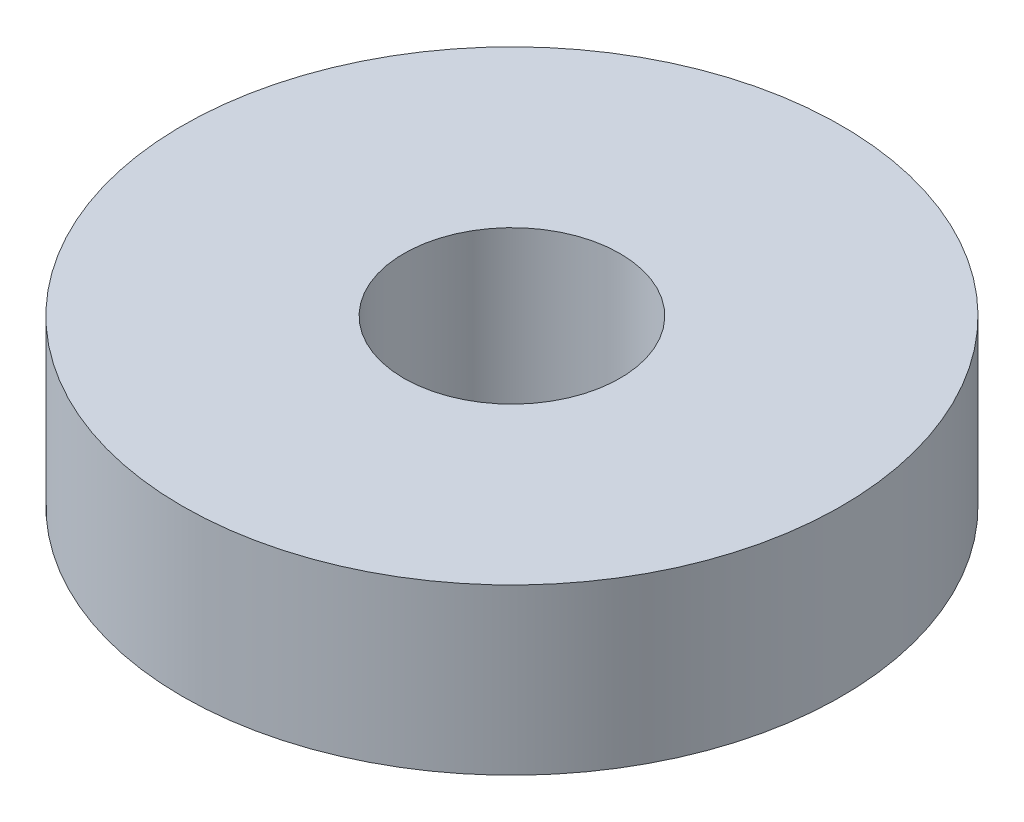
ISO-10303-21;
HEADER;
FILE_DESCRIPTION(('STEP AP214'),'2;1');
FILE_NAME('part.step','',(''),(''),'','','');
FILE_SCHEMA(('AUTOMOTIVE_DESIGN { 1 0 10303 214 1 1 1 1 }'));
ENDSEC;
DATA;
#1=APPLICATION_CONTEXT('core data for automotive mechanical design processes');
#2=APPLICATION_PROTOCOL_DEFINITION('international standard','automotive_design',2000,#1);
#3=PRODUCT_CONTEXT('',#1,'mechanical');
#4=PRODUCT('Part','Part','',(#3));
#5=PRODUCT_RELATED_PRODUCT_CATEGORY('part','',(#4));
#6=PRODUCT_DEFINITION_FORMATION('','',#4);
#7=PRODUCT_DEFINITION_CONTEXT('part definition',#1,'design');
#8=PRODUCT_DEFINITION('design','',#6,#7);
#9=PRODUCT_DEFINITION_SHAPE('','',#8);
#10=(LENGTH_UNIT() NAMED_UNIT(*) SI_UNIT(.MILLI.,.METRE.));
#11=(NAMED_UNIT(*) PLANE_ANGLE_UNIT() SI_UNIT($,.RADIAN.));
#12=(NAMED_UNIT(*) SI_UNIT($,.STERADIAN.) SOLID_ANGLE_UNIT());
#13=UNCERTAINTY_MEASURE_WITH_UNIT(LENGTH_MEASURE(1.E-05),#10,'distance_accuracy_value','');
#14=(GEOMETRIC_REPRESENTATION_CONTEXT(3) GLOBAL_UNCERTAINTY_ASSIGNED_CONTEXT((#13)) GLOBAL_UNIT_ASSIGNED_CONTEXT((#10,
#11,#12)) REPRESENTATION_CONTEXT('',''));
#15=CARTESIAN_POINT('',(0.,0.,0.));
#16=DIRECTION('',(0.,0.,1.));
#17=DIRECTION('',(1.,0.,0.));
#18=AXIS2_PLACEMENT_3D('',#15,#16,#17);
#19=CARTESIAN_POINT('',(0.,3.175,0.));
#20=DIRECTION('',(0.,1.,0.));
#21=DIRECTION('',(0.,0.,1.));
#22=AXIS2_PLACEMENT_3D('',#19,#20,#21);
#23=PLANE('',#22);
#24=CARTESIAN_POINT('',(0.,3.175,0.));
#25=DIRECTION('',(0.,1.,0.));
#26=DIRECTION('',(0.,0.,1.));
#27=AXIS2_PLACEMENT_3D('',#24,#25,#26);
#28=CIRCLE('',#27,6.35);
#29=CARTESIAN_POINT('',(0.,3.175,6.35));
#30=VERTEX_POINT('',#29);
#31=EDGE_CURVE('E10',#30,#30,#28,.T.);
#32=ORIENTED_EDGE('',*,*,#31,.T.);
#33=EDGE_LOOP('',(#32));
#34=FACE_BOUND('',#33,.T.);
#35=CARTESIAN_POINT('',(0.,3.175,0.));
#36=DIRECTION('',(0.,1.,0.));
#37=DIRECTION('',(0.,0.,1.));
#38=AXIS2_PLACEMENT_3D('',#35,#36,#37);
#39=CIRCLE('',#38,2.0828);
#40=CARTESIAN_POINT('',(0.,3.175,2.0828));
#41=VERTEX_POINT('',#40);
#42=EDGE_CURVE('E44',#41,#41,#39,.T.);
#43=ORIENTED_EDGE('',*,*,#42,.F.);
#44=EDGE_LOOP('',(#43));
#45=FACE_BOUND('',#44,.T.);
#46=ADVANCED_FACE('F33',(#34,#45),#23,.T.);
#47=CARTESIAN_POINT('',(0.,0.,0.));
#48=DIRECTION('',(0.,1.,0.));
#49=DIRECTION('',(0.,0.,1.));
#50=AXIS2_PLACEMENT_3D('',#47,#48,#49);
#51=PLANE('',#50);
#52=CARTESIAN_POINT('',(0.,0.,0.));
#53=DIRECTION('',(0.,1.,0.));
#54=DIRECTION('',(0.,0.,1.));
#55=AXIS2_PLACEMENT_3D('',#52,#53,#54);
#56=CIRCLE('',#55,6.35);
#57=CARTESIAN_POINT('',(0.,0.,6.35));
#58=VERTEX_POINT('',#57);
#59=EDGE_CURVE('E37',#58,#58,#56,.T.);
#60=ORIENTED_EDGE('',*,*,#59,.F.);
#61=EDGE_LOOP('',(#60));
#62=FACE_BOUND('',#61,.T.);
#63=CARTESIAN_POINT('',(0.,0.,0.));
#64=DIRECTION('',(0.,1.,0.));
#65=DIRECTION('',(0.,0.,1.));
#66=AXIS2_PLACEMENT_3D('',#63,#64,#65);
#67=CIRCLE('',#66,2.0828);
#68=CARTESIAN_POINT('',(0.,0.,2.0828));
#69=VERTEX_POINT('',#68);
#70=EDGE_CURVE('E46',#69,#69,#67,.T.);
#71=ORIENTED_EDGE('',*,*,#70,.T.);
#72=EDGE_LOOP('',(#71));
#73=FACE_BOUND('',#72,.T.);
#74=ADVANCED_FACE('F56',(#62,#73),#51,.F.);
#75=CARTESIAN_POINT('',(0.,3.175,0.));
#76=DIRECTION('',(0.,-1.,0.));
#77=DIRECTION('',(0.,0.,-1.));
#78=AXIS2_PLACEMENT_3D('',#75,#76,#77);
#79=CYLINDRICAL_SURFACE('',#78,6.35);
#80=ORIENTED_EDGE('',*,*,#31,.F.);
#81=EDGE_LOOP('',(#80));
#82=FACE_BOUND('',#81,.T.);
#83=ORIENTED_EDGE('',*,*,#59,.T.);
#84=EDGE_LOOP('',(#83));
#85=FACE_BOUND('',#84,.T.);
#86=ADVANCED_FACE('F35',(#82,#85),#79,.T.);
#87=CARTESIAN_POINT('',(0.,3.175,0.));
#88=DIRECTION('',(0.,-1.,0.));
#89=DIRECTION('',(0.,0.,-1.));
#90=AXIS2_PLACEMENT_3D('',#87,#88,#89);
#91=CYLINDRICAL_SURFACE('',#90,2.0828);
#92=ORIENTED_EDGE('',*,*,#42,.T.);
#93=EDGE_LOOP('',(#92));
#94=FACE_BOUND('',#93,.T.);
#95=ORIENTED_EDGE('',*,*,#70,.F.);
#96=EDGE_LOOP('',(#95));
#97=FACE_BOUND('',#96,.T.);
#98=ADVANCED_FACE('F52',(#94,#97),#91,.F.);
#99=CLOSED_SHELL('',(#46,#74,#86,#98));
#100=MANIFOLD_SOLID_BREP('B2',#99);
#101=ADVANCED_BREP_SHAPE_REPRESENTATION('',(#18,#100),#14);
#102=SHAPE_DEFINITION_REPRESENTATION(#9,#101);
ENDSEC;
END-ISO-10303-21;
